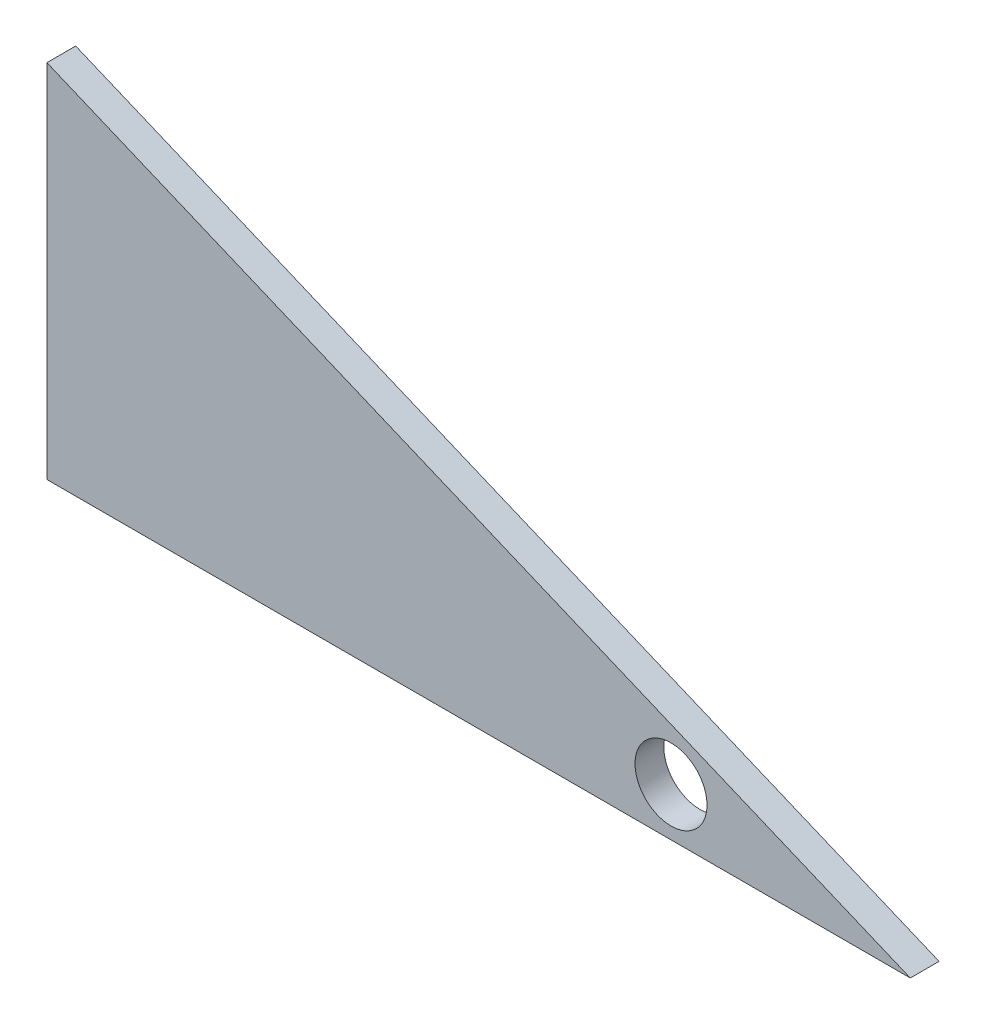
ISO-10303-21;
HEADER;
FILE_DESCRIPTION(('STEP AP214'),'2;1');
FILE_NAME('part.step','',(''),(''),'','','');
FILE_SCHEMA(('AUTOMOTIVE_DESIGN { 1 0 10303 214 1 1 1 1 }'));
ENDSEC;
DATA;
#1=APPLICATION_CONTEXT('core data for automotive mechanical design processes');
#2=APPLICATION_PROTOCOL_DEFINITION('international standard','automotive_design',2000,#1);
#3=PRODUCT_CONTEXT('',#1,'mechanical');
#4=PRODUCT('Part','Part','',(#3));
#5=PRODUCT_RELATED_PRODUCT_CATEGORY('part','',(#4));
#6=PRODUCT_DEFINITION_FORMATION('','',#4);
#7=PRODUCT_DEFINITION_CONTEXT('part definition',#1,'design');
#8=PRODUCT_DEFINITION('design','',#6,#7);
#9=PRODUCT_DEFINITION_SHAPE('','',#8);
#10=(LENGTH_UNIT() NAMED_UNIT(*) SI_UNIT(.MILLI.,.METRE.));
#11=(NAMED_UNIT(*) PLANE_ANGLE_UNIT() SI_UNIT($,.RADIAN.));
#12=(NAMED_UNIT(*) SI_UNIT($,.STERADIAN.) SOLID_ANGLE_UNIT());
#13=UNCERTAINTY_MEASURE_WITH_UNIT(LENGTH_MEASURE(1.E-05),#10,'distance_accuracy_value','');
#14=(GEOMETRIC_REPRESENTATION_CONTEXT(3) GLOBAL_UNCERTAINTY_ASSIGNED_CONTEXT((#13)) GLOBAL_UNIT_ASSIGNED_CONTEXT((#10,
#11,#12)) REPRESENTATION_CONTEXT('',''));
#15=CARTESIAN_POINT('',(0.,0.,0.));
#16=DIRECTION('',(0.,0.,1.));
#17=DIRECTION('',(1.,0.,0.));
#18=AXIS2_PLACEMENT_3D('',#15,#16,#17);
#19=CARTESIAN_POINT('',(0.,0.,3.81));
#20=DIRECTION('',(0.,0.,-1.));
#21=DIRECTION('',(-1.,0.,0.));
#22=AXIS2_PLACEMENT_3D('',#19,#20,#21);
#23=PLANE('',#22);
#24=DIRECTION('',(1.,0.,0.));
#25=VECTOR('',#24,1.);
#26=CARTESIAN_POINT('',(114.19529003204,0.,3.81));
#27=LINE('',#26,#25);
#28=CARTESIAN_POINT('',(0.,0.,3.81));
#29=VERTEX_POINT('',#28);
#30=CARTESIAN_POINT('',(114.19529003204,0.,3.81));
#31=VERTEX_POINT('',#30);
#32=EDGE_CURVE('E74',#29,#31,#27,.T.);
#33=ORIENTED_EDGE('',*,*,#32,.T.);
#34=DIRECTION('',(-0.92258676128103,0.385789667965563,0.));
#35=VECTOR('',#34,1.);
#36=CARTESIAN_POINT('',(1.61696878109296E-13,47.752,3.81));
#37=LINE('',#36,#35);
#38=CARTESIAN_POINT('',(1.61696878109296E-13,47.752,3.81));
#39=VERTEX_POINT('',#38);
#40=EDGE_CURVE('E70',#31,#39,#37,.T.);
#41=ORIENTED_EDGE('',*,*,#40,.T.);
#42=DIRECTION('',(0.,-1.,0.));
#43=VECTOR('',#42,1.);
#44=CARTESIAN_POINT('',(0.,0.,3.81));
#45=LINE('',#44,#43);
#46=EDGE_CURVE('E50',#39,#29,#45,.T.);
#47=ORIENTED_EDGE('',*,*,#46,.T.);
#48=EDGE_LOOP('',(#33,#41,#47));
#49=FACE_BOUND('',#48,.T.);
#50=CARTESIAN_POINT('',(82.55,6.34999999999999,3.81));
#51=DIRECTION('',(0.,0.,1.));
#52=DIRECTION('',(1.,0.,0.));
#53=AXIS2_PLACEMENT_3D('',#50,#51,#52);
#54=CIRCLE('',#53,4.7625);
#55=CARTESIAN_POINT('',(77.7875,6.34999999999999,3.81));
#56=VERTEX_POINT('',#55);
#57=EDGE_CURVE('E84',#56,#56,#54,.T.);
#58=ORIENTED_EDGE('',*,*,#57,.F.);
#59=EDGE_LOOP('',(#58));
#60=FACE_BOUND('',#59,.T.);
#61=ADVANCED_FACE('F33',(#49,#60),#23,.F.);
#62=CARTESIAN_POINT('',(0.,0.,0.));
#63=DIRECTION('',(0.,0.,-1.));
#64=DIRECTION('',(-1.,0.,0.));
#65=AXIS2_PLACEMENT_3D('',#62,#63,#64);
#66=PLANE('',#65);
#67=DIRECTION('',(1.,0.,0.));
#68=VECTOR('',#67,1.);
#69=CARTESIAN_POINT('',(114.19529003204,0.,0.));
#70=LINE('',#69,#68);
#71=CARTESIAN_POINT('',(0.,0.,0.));
#72=VERTEX_POINT('',#71);
#73=CARTESIAN_POINT('',(114.19529003204,0.,0.));
#74=VERTEX_POINT('',#73);
#75=EDGE_CURVE('E81',#72,#74,#70,.T.);
#76=ORIENTED_EDGE('',*,*,#75,.F.);
#77=DIRECTION('',(0.,-1.,0.));
#78=VECTOR('',#77,1.);
#79=CARTESIAN_POINT('',(0.,0.,0.));
#80=LINE('',#79,#78);
#81=CARTESIAN_POINT('',(1.61696878109296E-13,47.752,0.));
#82=VERTEX_POINT('',#81);
#83=EDGE_CURVE('E67',#82,#72,#80,.T.);
#84=ORIENTED_EDGE('',*,*,#83,.F.);
#85=DIRECTION('',(-0.92258676128103,0.385789667965563,0.));
#86=VECTOR('',#85,1.);
#87=CARTESIAN_POINT('',(1.61696878109296E-13,47.752,0.));
#88=LINE('',#87,#86);
#89=EDGE_CURVE('E62',#74,#82,#88,.T.);
#90=ORIENTED_EDGE('',*,*,#89,.F.);
#91=EDGE_LOOP('',(#76,#84,#90));
#92=FACE_BOUND('',#91,.T.);
#93=CARTESIAN_POINT('',(82.55,6.34999999999999,0.));
#94=DIRECTION('',(0.,0.,1.));
#95=DIRECTION('',(1.,0.,0.));
#96=AXIS2_PLACEMENT_3D('',#93,#94,#95);
#97=CIRCLE('',#96,4.7625);
#98=CARTESIAN_POINT('',(77.7875,6.34999999999999,0.));
#99=VERTEX_POINT('',#98);
#100=EDGE_CURVE('E88',#99,#99,#97,.T.);
#101=ORIENTED_EDGE('',*,*,#100,.T.);
#102=EDGE_LOOP('',(#101));
#103=FACE_BOUND('',#102,.T.);
#104=ADVANCED_FACE('F94',(#92,#103),#66,.T.);
#105=CARTESIAN_POINT('',(114.19529003204,0.,3.81));
#106=DIRECTION('',(0.,1.,0.));
#107=DIRECTION('',(-1.,0.,0.));
#108=AXIS2_PLACEMENT_3D('',#105,#106,#107);
#109=PLANE('',#108);
#110=ORIENTED_EDGE('',*,*,#75,.T.);
#111=DIRECTION('',(0.,0.,-1.));
#112=VECTOR('',#111,1.);
#113=CARTESIAN_POINT('',(114.19529003204,0.,3.81));
#114=LINE('',#113,#112);
#115=EDGE_CURVE('E11',#31,#74,#114,.T.);
#116=ORIENTED_EDGE('',*,*,#115,.F.);
#117=ORIENTED_EDGE('',*,*,#32,.F.);
#118=DIRECTION('',(0.,0.,-1.));
#119=VECTOR('',#118,1.);
#120=CARTESIAN_POINT('',(0.,0.,3.81));
#121=LINE('',#120,#119);
#122=EDGE_CURVE('E82',#29,#72,#121,.T.);
#123=ORIENTED_EDGE('',*,*,#122,.T.);
#124=EDGE_LOOP('',(#110,#116,#117,#123));
#125=FACE_BOUND('',#124,.T.);
#126=ADVANCED_FACE('F35',(#125),#109,.F.);
#127=CARTESIAN_POINT('',(1.61696878109296E-13,47.752,3.81));
#128=DIRECTION('',(-0.385789667965563,-0.92258676128103,0.));
#129=DIRECTION('',(0.92258676128103,-0.385789667965563,0.));
#130=AXIS2_PLACEMENT_3D('',#127,#128,#129);
#131=PLANE('',#130);
#132=ORIENTED_EDGE('',*,*,#89,.T.);
#133=DIRECTION('',(0.,0.,-1.));
#134=VECTOR('',#133,1.);
#135=CARTESIAN_POINT('',(1.61696878109296E-13,47.752,3.81));
#136=LINE('',#135,#134);
#137=EDGE_CURVE('E42',#39,#82,#136,.T.);
#138=ORIENTED_EDGE('',*,*,#137,.F.);
#139=ORIENTED_EDGE('',*,*,#40,.F.);
#140=ORIENTED_EDGE('',*,*,#115,.T.);
#141=EDGE_LOOP('',(#132,#138,#139,#140));
#142=FACE_BOUND('',#141,.T.);
#143=ADVANCED_FACE('F71',(#142),#131,.F.);
#144=CARTESIAN_POINT('',(0.,0.,3.81));
#145=DIRECTION('',(1.,0.,0.));
#146=DIRECTION('',(0.,1.,0.));
#147=AXIS2_PLACEMENT_3D('',#144,#145,#146);
#148=PLANE('',#147);
#149=ORIENTED_EDGE('',*,*,#83,.T.);
#150=ORIENTED_EDGE('',*,*,#122,.F.);
#151=ORIENTED_EDGE('',*,*,#46,.F.);
#152=ORIENTED_EDGE('',*,*,#137,.T.);
#153=EDGE_LOOP('',(#149,#150,#151,#152));
#154=FACE_BOUND('',#153,.T.);
#155=ADVANCED_FACE('F93',(#154),#148,.F.);
#156=CARTESIAN_POINT('',(82.55,6.34999999999999,3.81));
#157=DIRECTION('',(0.,0.,-1.));
#158=DIRECTION('',(-1.,0.,0.));
#159=AXIS2_PLACEMENT_3D('',#156,#157,#158);
#160=CYLINDRICAL_SURFACE('',#159,4.7625);
#161=CARTESIAN_POINT('',(77.7875,6.34999999999999,3.81));
#162=CARTESIAN_POINT('',(77.7875,6.34999999999999,3.7703125));
#163=CARTESIAN_POINT('',(77.7875,6.34999999999999,3.730625));
#164=CARTESIAN_POINT('',(77.7875,6.34999999999999,3.65125));
#165=CARTESIAN_POINT('',(77.7875,6.34999999999999,3.6115625));
#166=CARTESIAN_POINT('',(77.7875,6.34999999999999,3.5321875));
#167=CARTESIAN_POINT('',(77.7875,6.34999999999999,3.4925));
#168=CARTESIAN_POINT('',(77.7875,6.34999999999999,3.413125));
#169=CARTESIAN_POINT('',(77.7875,6.34999999999999,3.3734375));
#170=CARTESIAN_POINT('',(77.7875,6.34999999999999,3.2940625));
#171=CARTESIAN_POINT('',(77.7875,6.34999999999999,3.254375));
#172=CARTESIAN_POINT('',(77.7875,6.34999999999999,3.175));
#173=CARTESIAN_POINT('',(77.7875,6.34999999999999,3.1353125));
#174=CARTESIAN_POINT('',(77.7875,6.34999999999999,3.0559375));
#175=CARTESIAN_POINT('',(77.7875,6.34999999999999,3.01625));
#176=CARTESIAN_POINT('',(77.7875,6.34999999999999,2.936875));
#177=CARTESIAN_POINT('',(77.7875,6.34999999999999,2.8971875));
#178=CARTESIAN_POINT('',(77.7875,6.34999999999999,2.8178125));
#179=CARTESIAN_POINT('',(77.7875,6.34999999999999,2.778125));
#180=CARTESIAN_POINT('',(77.7875,6.34999999999999,2.69875));
#181=CARTESIAN_POINT('',(77.7875,6.34999999999999,2.6590625));
#182=CARTESIAN_POINT('',(77.7875,6.34999999999999,2.5796875));
#183=CARTESIAN_POINT('',(77.7875,6.34999999999999,2.54));
#184=CARTESIAN_POINT('',(77.7875,6.34999999999999,2.460625));
#185=CARTESIAN_POINT('',(77.7875,6.34999999999999,2.4209375));
#186=CARTESIAN_POINT('',(77.7875,6.34999999999999,2.3415625));
#187=CARTESIAN_POINT('',(77.7875,6.34999999999999,2.301875));
#188=CARTESIAN_POINT('',(77.7875,6.34999999999999,2.2225));
#189=CARTESIAN_POINT('',(77.7875,6.34999999999999,2.1828125));
#190=CARTESIAN_POINT('',(77.7875,6.34999999999999,2.1034375));
#191=CARTESIAN_POINT('',(77.7875,6.34999999999999,2.06375));
#192=CARTESIAN_POINT('',(77.7875,6.34999999999999,1.984375));
#193=CARTESIAN_POINT('',(77.7875,6.34999999999999,1.9446875));
#194=CARTESIAN_POINT('',(77.7875,6.34999999999999,1.8653125));
#195=CARTESIAN_POINT('',(77.7875,6.34999999999999,1.825625));
#196=CARTESIAN_POINT('',(77.7875,6.34999999999999,1.74625));
#197=CARTESIAN_POINT('',(77.7875,6.34999999999999,1.7065625));
#198=CARTESIAN_POINT('',(77.7875,6.34999999999999,1.6271875));
#199=CARTESIAN_POINT('',(77.7875,6.34999999999999,1.5875));
#200=CARTESIAN_POINT('',(77.7875,6.34999999999999,1.508125));
#201=CARTESIAN_POINT('',(77.7875,6.34999999999999,1.4684375));
#202=CARTESIAN_POINT('',(77.7875,6.34999999999999,1.3890625));
#203=CARTESIAN_POINT('',(77.7875,6.34999999999999,1.349375));
#204=CARTESIAN_POINT('',(77.7875,6.34999999999999,1.27));
#205=CARTESIAN_POINT('',(77.7875,6.34999999999999,1.2303125));
#206=CARTESIAN_POINT('',(77.7875,6.34999999999999,1.1509375));
#207=CARTESIAN_POINT('',(77.7875,6.34999999999999,1.11125));
#208=CARTESIAN_POINT('',(77.7875,6.34999999999999,1.031875));
#209=CARTESIAN_POINT('',(77.7875,6.34999999999999,0.9921875));
#210=CARTESIAN_POINT('',(77.7875,6.34999999999999,0.9128125));
#211=CARTESIAN_POINT('',(77.7875,6.34999999999999,0.873125));
#212=CARTESIAN_POINT('',(77.7875,6.34999999999999,0.79375));
#213=CARTESIAN_POINT('',(77.7875,6.34999999999999,0.7540625));
#214=CARTESIAN_POINT('',(77.7875,6.34999999999999,0.6746875));
#215=CARTESIAN_POINT('',(77.7875,6.34999999999999,0.635));
#216=CARTESIAN_POINT('',(77.7875,6.34999999999999,0.555625));
#217=CARTESIAN_POINT('',(77.7875,6.34999999999999,0.5159375));
#218=CARTESIAN_POINT('',(77.7875,6.34999999999999,0.4365625));
#219=CARTESIAN_POINT('',(77.7875,6.34999999999999,0.396875));
#220=CARTESIAN_POINT('',(77.7875,6.34999999999999,0.3175));
#221=CARTESIAN_POINT('',(77.7875,6.34999999999999,0.2778125));
#222=CARTESIAN_POINT('',(77.7875,6.34999999999999,0.1984375));
#223=CARTESIAN_POINT('',(77.7875,6.34999999999999,0.15875));
#224=CARTESIAN_POINT('',(77.7875,6.34999999999999,0.0793749999999999));
#225=CARTESIAN_POINT('',(77.7875,6.34999999999999,0.0396874999999999));
#226=CARTESIAN_POINT('',(77.7875,6.34999999999999,0.));
#227=B_SPLINE_CURVE_WITH_KNOTS('',3,(#161,#162,#163,#164,#165,#166,#167,#168,#169,#170,#171,
#172,#173,#174,#175,#176,#177,#178,#179,#180,#181,#182,#183,#184,#185,#186,#187,#188,#189,#190,
#191,#192,#193,#194,#195,#196,#197,#198,#199,#200,#201,#202,#203,#204,#205,#206,#207,#208,#209,
#210,#211,#212,#213,#214,#215,#216,#217,#218,#219,#220,#221,#222,#223,#224,#225,#226),
.UNSPECIFIED.,.F.,.F.,(4,2,2,2,2,2,2,2,2,2,2,2,2,2,2,2,2,2,2,2,2,2,2,2,2,2,2,2,2,2,2,2,4),(0.,
0.1190625,0.238125,0.3571875,0.47625,0.595312499999999,0.714375,0.833437499999999,
0.952499999999999,1.0715625,1.190625,1.3096875,1.42875,1.5478125,1.666875,1.7859375,1.905,
2.0240625,2.143125,2.2621875,2.38125,2.5003125,2.619375,2.7384375,2.8575,2.9765625,3.095625,
3.2146875,3.33375,3.4528125,3.571875,3.6909375,3.81),.UNSPECIFIED.);
#228=EDGE_CURVE('BSEAM102',#56,#99,#227,.T.);
#229=ORIENTED_EDGE('',*,*,#57,.T.);
#230=ORIENTED_EDGE('',*,*,#100,.F.);
#231=ORIENTED_EDGE('',*,*,#228,.T.);
#232=ORIENTED_EDGE('',*,*,#228,.F.);
#233=EDGE_LOOP('',(#229,#231,#230,#232));
#234=FACE_BOUND('',#233,.T.);
#235=ADVANCED_FACE('F102',(#234),#160,.F.);
#236=CLOSED_SHELL('',(#61,#104,#126,#143,#155,#235));
#237=MANIFOLD_SOLID_BREP('B2',#236);
#238=ADVANCED_BREP_SHAPE_REPRESENTATION('',(#18,#237),#14);
#239=SHAPE_DEFINITION_REPRESENTATION(#9,#238);
ENDSEC;
END-ISO-10303-21;
